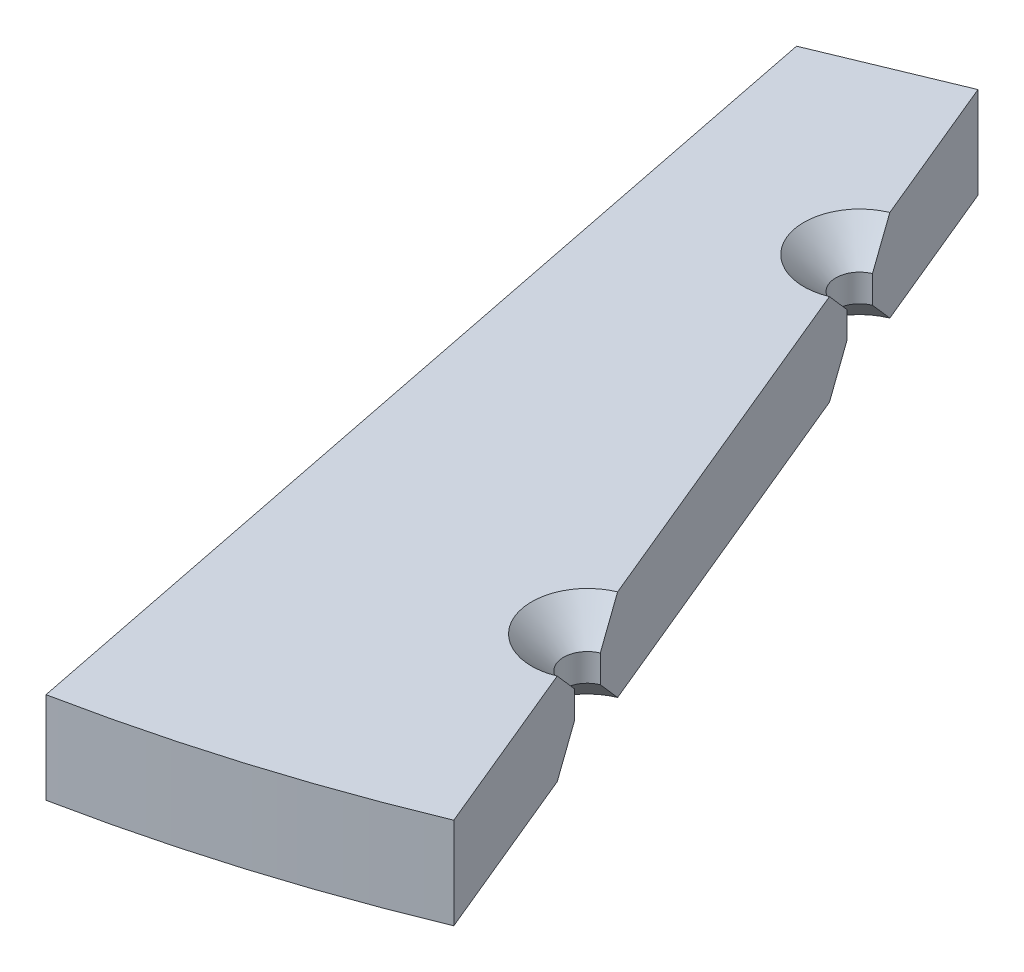
ISO-10303-21;
HEADER;
FILE_DESCRIPTION(('STEP AP214'),'2;1');
FILE_NAME('part.step','',(''),(''),'','','');
FILE_SCHEMA(('AUTOMOTIVE_DESIGN { 1 0 10303 214 1 1 1 1 }'));
ENDSEC;
DATA;
#1=APPLICATION_CONTEXT('core data for automotive mechanical design processes');
#2=APPLICATION_PROTOCOL_DEFINITION('international standard','automotive_design',2000,#1);
#3=PRODUCT_CONTEXT('',#1,'mechanical');
#4=PRODUCT('Part','Part','',(#3));
#5=PRODUCT_RELATED_PRODUCT_CATEGORY('part','',(#4));
#6=PRODUCT_DEFINITION_FORMATION('','',#4);
#7=PRODUCT_DEFINITION_CONTEXT('part definition',#1,'design');
#8=PRODUCT_DEFINITION('design','',#6,#7);
#9=PRODUCT_DEFINITION_SHAPE('','',#8);
#10=(LENGTH_UNIT() NAMED_UNIT(*) SI_UNIT(.MILLI.,.METRE.));
#11=(NAMED_UNIT(*) PLANE_ANGLE_UNIT() SI_UNIT($,.RADIAN.));
#12=(NAMED_UNIT(*) SI_UNIT($,.STERADIAN.) SOLID_ANGLE_UNIT());
#13=UNCERTAINTY_MEASURE_WITH_UNIT(LENGTH_MEASURE(1.E-05),#10,'distance_accuracy_value','');
#14=(GEOMETRIC_REPRESENTATION_CONTEXT(3) GLOBAL_UNCERTAINTY_ASSIGNED_CONTEXT((#13)) GLOBAL_UNIT_ASSIGNED_CONTEXT((#10,
#11,#12)) REPRESENTATION_CONTEXT('',''));
#15=CARTESIAN_POINT('',(0.,0.,0.));
#16=DIRECTION('',(0.,0.,1.));
#17=DIRECTION('',(1.,0.,0.));
#18=AXIS2_PLACEMENT_3D('',#15,#16,#17);
#19=CARTESIAN_POINT('',(39.0337101012386,-0.00999999999999959,94.2357123161515));
#20=DIRECTION('',(0.,1.,0.));
#21=DIRECTION('',(0.,0.,1.));
#22=AXIS2_PLACEMENT_3D('',#19,#20,#21);
#23=CYLINDRICAL_SURFACE('',#22,2.60000000000001);
#24=DIRECTION('',(0.,1.,0.));
#25=VECTOR('',#24,1.);
#26=CARTESIAN_POINT('',(38.0387331770894,-0.00999999999999959,91.8336255316221));
#27=LINE('',#26,#25);
#28=CARTESIAN_POINT('',(38.0387331770894,3.49000000000001,91.8336255316221));
#29=VERTEX_POINT('',#28);
#30=CARTESIAN_POINT('',(38.0387331770894,6.48999999999999,91.8336255316221));
#31=VERTEX_POINT('',#30);
#32=EDGE_CURVE('E161',#29,#31,#27,.T.);
#33=ORIENTED_EDGE('',*,*,#32,.T.);
#34=CARTESIAN_POINT('',(39.0337101012386,6.48999999999999,94.2357123161515));
#35=DIRECTION('',(0.,-1.,0.));
#36=DIRECTION('',(0.,0.,-1.));
#37=AXIS2_PLACEMENT_3D('',#34,#35,#36);
#38=CIRCLE('',#37,2.60000000000001);
#39=CARTESIAN_POINT('',(40.0286870253878,6.48999999999999,96.6377991006809));
#40=VERTEX_POINT('',#39);
#41=EDGE_CURVE('E43',#31,#40,#38,.F.);
#42=ORIENTED_EDGE('',*,*,#41,.T.);
#43=DIRECTION('',(0.,1.,0.));
#44=VECTOR('',#43,1.);
#45=CARTESIAN_POINT('',(40.0286870253878,-0.00999999999999959,96.6377991006809));
#46=LINE('',#45,#44);
#47=CARTESIAN_POINT('',(40.0286870253878,3.49000000000001,96.6377991006809));
#48=VERTEX_POINT('',#47);
#49=EDGE_CURVE('E186',#48,#40,#46,.T.);
#50=ORIENTED_EDGE('',*,*,#49,.F.);
#51=CARTESIAN_POINT('',(39.0337101012386,3.49000000000001,94.2357123161515));
#52=DIRECTION('',(0.,-1.,0.));
#53=DIRECTION('',(0.,0.,-1.));
#54=AXIS2_PLACEMENT_3D('',#51,#52,#53);
#55=CIRCLE('',#54,2.60000000000001);
#56=EDGE_CURVE('E197',#48,#29,#55,.T.);
#57=ORIENTED_EDGE('',*,*,#56,.T.);
#58=EDGE_LOOP('',(#33,#42,#50,#57));
#59=FACE_BOUND('',#58,.T.);
#60=ADVANCED_FACE('F34',(#59),#23,.F.);
#61=CARTESIAN_POINT('',(59.0863219571689,-0.00999999999999959,142.646999819743));
#62=DIRECTION('',(-0.923879532511289,0.,0.382683432365084));
#63=DIRECTION('',(0.382683432365084,0.,0.923879532511289));
#64=AXIS2_PLACEMENT_3D('',#61,#62,#63);
#65=PLANE('',#64);
#66=DIRECTION('',(0.382683432365083,0.,0.923879532511289));
#67=VECTOR('',#66,1.);
#68=CARTESIAN_POINT('',(59.0863219571689,9.99,142.646999819743));
#69=LINE('',#68,#67);
#70=CARTESIAN_POINT('',(41.3680790386656,9.99,99.8713774644704));
#71=VERTEX_POINT('',#70);
#72=CARTESIAN_POINT('',(57.7469299438912,9.99,139.413421455954));
#73=VERTEX_POINT('',#72);
#74=EDGE_CURVE('E162',#71,#73,#69,.T.);
#75=ORIENTED_EDGE('',*,*,#74,.T.);
#76=DIRECTION('',(0.270598050073094,-0.707106781186547,0.653281482438191));
#77=VECTOR('',#76,1.);
#78=CARTESIAN_POINT('',(60.0812988813182,3.89,145.049086604272));
#79=LINE('',#78,#77);
#80=CARTESIAN_POINT('',(59.0863219571689,6.49000000000001,142.646999819743));
#81=VERTEX_POINT('',#80);
#82=EDGE_CURVE('E215',#73,#81,#79,.T.);
#83=ORIENTED_EDGE('',*,*,#82,.T.);
#84=DIRECTION('',(0.,1.,0.));
#85=VECTOR('',#84,1.);
#86=CARTESIAN_POINT('',(59.0863219571689,-0.00999999999999959,142.646999819743));
#87=LINE('',#86,#85);
#88=CARTESIAN_POINT('',(59.0863219571689,3.49,142.646999819743));
#89=VERTEX_POINT('',#88);
#90=EDGE_CURVE('E183',#89,#81,#87,.T.);
#91=ORIENTED_EDGE('',*,*,#90,.F.);
#92=DIRECTION('',(-0.270598050073093,-0.70710678118655,-0.653281482438188));
#93=VECTOR('',#92,1.);
#94=CARTESIAN_POINT('',(60.0812988813182,6.09000000000002,145.049086604272));
#95=LINE('',#94,#93);
#96=CARTESIAN_POINT('',(57.7469299438912,-0.00999999999999959,139.413421455954));
#97=VERTEX_POINT('',#96);
#98=EDGE_CURVE('E193',#89,#97,#95,.T.);
#99=ORIENTED_EDGE('',*,*,#98,.T.);
#100=DIRECTION('',(0.382683432365083,0.,0.923879532511289));
#101=VECTOR('',#100,1.);
#102=CARTESIAN_POINT('',(59.0863219571689,-0.00999999999999959,142.646999819743));
#103=LINE('',#102,#101);
#104=CARTESIAN_POINT('',(41.3680790386656,-0.00999999999999959,99.8713774644704));
#105=VERTEX_POINT('',#104);
#106=EDGE_CURVE('E136',#105,#97,#103,.T.);
#107=ORIENTED_EDGE('',*,*,#106,.F.);
#108=DIRECTION('',(-0.270598050073093,0.70710678118655,-0.653281482438188));
#109=VECTOR('',#108,1.);
#110=CARTESIAN_POINT('',(39.0337101012386,6.09000000000003,94.2357123161515));
#111=LINE('',#110,#109);
#112=EDGE_CURVE('E195',#105,#48,#111,.T.);
#113=ORIENTED_EDGE('',*,*,#112,.T.);
#114=ORIENTED_EDGE('',*,*,#49,.T.);
#115=DIRECTION('',(0.270598050073095,0.707106781186546,0.653281482438192));
#116=VECTOR('',#115,1.);
#117=CARTESIAN_POINT('',(39.0337101012386,3.89,94.2357123161515));
#118=LINE('',#117,#116);
#119=EDGE_CURVE('E56',#40,#71,#118,.T.);
#120=ORIENTED_EDGE('',*,*,#119,.T.);
#121=EDGE_LOOP('',(#75,#83,#91,#99,#107,#113,#114,#120));
#122=FACE_BOUND('',#121,.T.);
#123=ADVANCED_FACE('F220',(#122),#65,.F.);
#124=CARTESIAN_POINT('',(60.0812988813182,-0.00999999999999959,145.049086604272));
#125=DIRECTION('',(0.,1.,0.));
#126=DIRECTION('',(0.,0.,1.));
#127=AXIS2_PLACEMENT_3D('',#124,#125,#126);
#128=CYLINDRICAL_SURFACE('',#127,2.60000000000001);
#129=ORIENTED_EDGE('',*,*,#90,.T.);
#130=CARTESIAN_POINT('',(60.0812988813182,6.49000000000001,145.049086604272));
#131=DIRECTION('',(0.,-1.,0.));
#132=DIRECTION('',(0.,0.,-1.));
#133=AXIS2_PLACEMENT_3D('',#130,#131,#132);
#134=CIRCLE('',#133,2.60000000000001);
#135=CARTESIAN_POINT('',(61.0762758054673,6.49000000000001,147.451173388802));
#136=VERTEX_POINT('',#135);
#137=EDGE_CURVE('E205',#81,#136,#134,.F.);
#138=ORIENTED_EDGE('',*,*,#137,.T.);
#139=DIRECTION('',(0.,1.,0.));
#140=VECTOR('',#139,1.);
#141=CARTESIAN_POINT('',(61.0762758054673,-0.00999999999999959,147.451173388802));
#142=LINE('',#141,#140);
#143=CARTESIAN_POINT('',(61.0762758054673,3.49,147.451173388802));
#144=VERTEX_POINT('',#143);
#145=EDGE_CURVE('E146',#144,#136,#142,.T.);
#146=ORIENTED_EDGE('',*,*,#145,.F.);
#147=CARTESIAN_POINT('',(60.0812988813182,3.49,145.049086604272));
#148=DIRECTION('',(0.,-1.,0.));
#149=DIRECTION('',(0.,0.,-1.));
#150=AXIS2_PLACEMENT_3D('',#147,#148,#149);
#151=CIRCLE('',#150,2.60000000000001);
#152=EDGE_CURVE('E203',#144,#89,#151,.T.);
#153=ORIENTED_EDGE('',*,*,#152,.T.);
#154=EDGE_LOOP('',(#129,#138,#146,#153));
#155=FACE_BOUND('',#154,.T.);
#156=ADVANCED_FACE('F249',(#155),#128,.F.);
#157=CARTESIAN_POINT('',(70.4137515551754,-0.00999999999999959,169.993833982077));
#158=DIRECTION('',(-0.92387953251129,0.,0.382683432365083));
#159=DIRECTION('',(0.382683432365083,0.,0.92387953251129));
#160=AXIS2_PLACEMENT_3D('',#157,#158,#159);
#161=PLANE('',#160);
#162=ORIENTED_EDGE('',*,*,#145,.T.);
#163=DIRECTION('',(0.270598050073094,0.707106781186547,0.653281482438191));
#164=VECTOR('',#163,1.);
#165=CARTESIAN_POINT('',(60.0812988813181,3.89,145.049086604272));
#166=LINE('',#165,#164);
#167=CARTESIAN_POINT('',(62.4156678187451,9.99,150.684751752591));
#168=VERTEX_POINT('',#167);
#169=EDGE_CURVE('E208',#136,#168,#166,.T.);
#170=ORIENTED_EDGE('',*,*,#169,.T.);
#171=DIRECTION('',(0.382683432365083,0.,0.92387953251129));
#172=VECTOR('',#171,1.);
#173=CARTESIAN_POINT('',(70.4137515551754,9.99,169.993833982077));
#174=LINE('',#173,#172);
#175=CARTESIAN_POINT('',(70.4137515551754,9.99,169.993833982077));
#176=VERTEX_POINT('',#175);
#177=EDGE_CURVE('E143',#168,#176,#174,.T.);
#178=ORIENTED_EDGE('',*,*,#177,.T.);
#179=DIRECTION('',(0.,1.,0.));
#180=VECTOR('',#179,1.);
#181=CARTESIAN_POINT('',(70.4137515551754,-0.00999999999999959,169.993833982077));
#182=LINE('',#181,#180);
#183=CARTESIAN_POINT('',(70.4137515551754,-0.00999999999999959,169.993833982077));
#184=VERTEX_POINT('',#183);
#185=EDGE_CURVE('E139',#184,#176,#182,.T.);
#186=ORIENTED_EDGE('',*,*,#185,.F.);
#187=DIRECTION('',(0.382683432365083,0.,0.92387953251129));
#188=VECTOR('',#187,1.);
#189=CARTESIAN_POINT('',(70.4137515551754,-0.00999999999999959,169.993833982077));
#190=LINE('',#189,#188);
#191=CARTESIAN_POINT('',(62.4156678187451,-0.00999999999999959,150.684751752591));
#192=VERTEX_POINT('',#191);
#193=EDGE_CURVE('E125',#192,#184,#190,.T.);
#194=ORIENTED_EDGE('',*,*,#193,.F.);
#195=DIRECTION('',(-0.270598050073093,0.70710678118655,-0.653281482438188));
#196=VECTOR('',#195,1.);
#197=CARTESIAN_POINT('',(60.0812988813181,6.09000000000002,145.049086604272));
#198=LINE('',#197,#196);
#199=EDGE_CURVE('E201',#192,#144,#198,.T.);
#200=ORIENTED_EDGE('',*,*,#199,.T.);
#201=EDGE_LOOP('',(#162,#170,#178,#186,#194,#200));
#202=FACE_BOUND('',#201,.T.);
#203=ADVANCED_FACE('F141',(#202),#161,.F.);
#204=CARTESIAN_POINT('',(0.,-0.00999999999999959,0.));
#205=DIRECTION('',(0.,1.,0.));
#206=DIRECTION('',(0.,0.,1.));
#207=AXIS2_PLACEMENT_3D('',#204,#205,#206);
#208=CYLINDRICAL_SURFACE('',#207,184.);
#209=CARTESIAN_POINT('',(0.,9.99,0.));
#210=DIRECTION('',(0.,-1.,0.));
#211=DIRECTION('',(0.,0.,1.));
#212=AXIS2_PLACEMENT_3D('',#209,#210,#211);
#213=CIRCLE('',#212,184.);
#214=CARTESIAN_POINT('',(36.229696886259,9.99,180.397918678486));
#215=VERTEX_POINT('',#214);
#216=EDGE_CURVE('E166',#176,#215,#213,.T.);
#217=ORIENTED_EDGE('',*,*,#216,.T.);
#218=DIRECTION('',(0.,1.,0.));
#219=VECTOR('',#218,1.);
#220=CARTESIAN_POINT('',(36.229696886259,-0.00999999999999959,180.397918678486));
#221=LINE('',#220,#219);
#222=CARTESIAN_POINT('',(36.229696886259,-0.00999999999999959,180.397918678486));
#223=VERTEX_POINT('',#222);
#224=EDGE_CURVE('E147',#223,#215,#221,.T.);
#225=ORIENTED_EDGE('',*,*,#224,.F.);
#226=CARTESIAN_POINT('',(0.,-0.00999999999999959,0.));
#227=DIRECTION('',(0.,-1.,0.));
#228=DIRECTION('',(0.,0.,1.));
#229=AXIS2_PLACEMENT_3D('',#226,#227,#228);
#230=CIRCLE('',#229,184.);
#231=EDGE_CURVE('E130',#184,#223,#230,.T.);
#232=ORIENTED_EDGE('',*,*,#231,.F.);
#233=ORIENTED_EDGE('',*,*,#185,.T.);
#234=EDGE_LOOP('',(#217,#225,#232,#233));
#235=FACE_BOUND('',#234,.T.);
#236=ADVANCED_FACE('F149',(#235),#208,.T.);
#237=CARTESIAN_POINT('',(15.8517712634232,-0.00999999999999959,77.9511684271959));
#238=DIRECTION('',(0.980785280403232,0.,-0.19509032201612));
#239=DIRECTION('',(-0.19509032201612,0.,-0.980785280403232));
#240=AXIS2_PLACEMENT_3D('',#237,#238,#239);
#241=PLANE('',#240);
#242=DIRECTION('',(-0.19509032201612,0.,-0.980785280403232));
#243=VECTOR('',#242,1.);
#244=CARTESIAN_POINT('',(15.8517712634232,9.99,77.9511684271959));
#245=LINE('',#244,#243);
#246=CARTESIAN_POINT('',(15.8517712634232,9.99,77.9511684271959));
#247=VERTEX_POINT('',#246);
#248=EDGE_CURVE('E168',#215,#247,#245,.T.);
#249=ORIENTED_EDGE('',*,*,#248,.T.);
#250=DIRECTION('',(0.,1.,0.));
#251=VECTOR('',#250,1.);
#252=CARTESIAN_POINT('',(15.8517712634232,-0.00999999999999959,77.9511684271959));
#253=LINE('',#252,#251);
#254=CARTESIAN_POINT('',(15.8517712634232,-0.00999999999999959,77.9511684271959));
#255=VERTEX_POINT('',#254);
#256=EDGE_CURVE('E178',#255,#247,#253,.T.);
#257=ORIENTED_EDGE('',*,*,#256,.F.);
#258=DIRECTION('',(-0.19509032201612,0.,-0.980785280403232));
#259=VECTOR('',#258,1.);
#260=CARTESIAN_POINT('',(15.8517712634232,-0.00999999999999959,77.9511684271959));
#261=LINE('',#260,#259);
#262=EDGE_CURVE('E152',#223,#255,#261,.T.);
#263=ORIENTED_EDGE('',*,*,#262,.F.);
#264=ORIENTED_EDGE('',*,*,#224,.T.);
#265=EDGE_LOOP('',(#249,#257,#263,#264));
#266=FACE_BOUND('',#265,.T.);
#267=ADVANCED_FACE('F279',(#266),#241,.F.);
#268=CARTESIAN_POINT('',(15.8517712634232,-0.00999999999999959,77.9511684271959));
#269=DIRECTION('',(0.382683432365084,0.,0.923879532511289));
#270=DIRECTION('',(0.923879532511289,0.,-0.382683432365084));
#271=AXIS2_PLACEMENT_3D('',#268,#269,#270);
#272=PLANE('',#271);
#273=DIRECTION('',(0.923879532511289,0.,-0.382683432365084));
#274=VECTOR('',#273,1.);
#275=CARTESIAN_POINT('',(15.8517712634232,9.99,77.9511684271959));
#276=LINE('',#275,#274);
#277=CARTESIAN_POINT('',(29.8813380527613,9.99,72.139931588833));
#278=VERTEX_POINT('',#277);
#279=EDGE_CURVE('E170',#247,#278,#276,.T.);
#280=ORIENTED_EDGE('',*,*,#279,.T.);
#281=DIRECTION('',(0.,1.,0.));
#282=VECTOR('',#281,1.);
#283=CARTESIAN_POINT('',(29.8813380527613,-0.00999999999999959,72.139931588833));
#284=LINE('',#283,#282);
#285=CARTESIAN_POINT('',(29.8813380527613,-0.00999999999999959,72.139931588833));
#286=VERTEX_POINT('',#285);
#287=EDGE_CURVE('E175',#286,#278,#284,.T.);
#288=ORIENTED_EDGE('',*,*,#287,.F.);
#289=DIRECTION('',(0.923879532511289,0.,-0.382683432365084));
#290=VECTOR('',#289,1.);
#291=CARTESIAN_POINT('',(15.8517712634232,-0.00999999999999959,77.9511684271959));
#292=LINE('',#291,#290);
#293=EDGE_CURVE('E154',#255,#286,#292,.T.);
#294=ORIENTED_EDGE('',*,*,#293,.F.);
#295=ORIENTED_EDGE('',*,*,#256,.T.);
#296=EDGE_LOOP('',(#280,#288,#294,#295));
#297=FACE_BOUND('',#296,.T.);
#298=ADVANCED_FACE('F281',(#297),#272,.F.);
#299=CARTESIAN_POINT('',(38.0387331770894,-0.00999999999999959,91.8336255316221));
#300=DIRECTION('',(-0.923879532511289,0.,0.382683432365085));
#301=DIRECTION('',(0.382683432365085,0.,0.923879532511289));
#302=AXIS2_PLACEMENT_3D('',#299,#300,#301);
#303=PLANE('',#302);
#304=DIRECTION('',(0.382683432365085,0.,0.923879532511289));
#305=VECTOR('',#304,1.);
#306=CARTESIAN_POINT('',(38.0387331770894,9.99,91.8336255316221));
#307=LINE('',#306,#305);
#308=CARTESIAN_POINT('',(36.6993411638116,9.99,88.6000471678326));
#309=VERTEX_POINT('',#308);
#310=EDGE_CURVE('E172',#278,#309,#307,.T.);
#311=ORIENTED_EDGE('',*,*,#310,.T.);
#312=DIRECTION('',(0.270598050073096,-0.707106781186546,0.653281482438191));
#313=VECTOR('',#312,1.);
#314=CARTESIAN_POINT('',(39.0337101012386,3.89,94.2357123161515));
#315=LINE('',#314,#313);
#316=EDGE_CURVE('E11',#309,#31,#315,.T.);
#317=ORIENTED_EDGE('',*,*,#316,.T.);
#318=ORIENTED_EDGE('',*,*,#32,.F.);
#319=DIRECTION('',(-0.270598050073094,-0.70710678118655,-0.653281482438187));
#320=VECTOR('',#319,1.);
#321=CARTESIAN_POINT('',(39.0337101012386,6.09000000000003,94.2357123161515));
#322=LINE('',#321,#320);
#323=CARTESIAN_POINT('',(36.6993411638116,-0.00999999999999959,88.6000471678327));
#324=VERTEX_POINT('',#323);
#325=EDGE_CURVE('E199',#29,#324,#322,.T.);
#326=ORIENTED_EDGE('',*,*,#325,.T.);
#327=DIRECTION('',(0.382683432365085,0.,0.923879532511289));
#328=VECTOR('',#327,1.);
#329=CARTESIAN_POINT('',(38.0387331770894,-0.00999999999999959,91.8336255316221));
#330=LINE('',#329,#328);
#331=EDGE_CURVE('E159',#286,#324,#330,.T.);
#332=ORIENTED_EDGE('',*,*,#331,.F.);
#333=ORIENTED_EDGE('',*,*,#287,.T.);
#334=EDGE_LOOP('',(#311,#317,#318,#326,#332,#333));
#335=FACE_BOUND('',#334,.T.);
#336=ADVANCED_FACE('F230',(#335),#303,.F.);
#337=CARTESIAN_POINT('',(39.0337101012386,-0.00999999999999959,94.2357123161515));
#338=DIRECTION('',(0.,-1.,0.));
#339=DIRECTION('',(0.,0.,-1.));
#340=AXIS2_PLACEMENT_3D('',#337,#338,#339);
#341=PLANE('',#340);
#342=ORIENTED_EDGE('',*,*,#331,.T.);
#343=CARTESIAN_POINT('',(39.0337101012386,-0.00999999999999959,94.2357123161515));
#344=DIRECTION('',(0.,-1.,0.));
#345=DIRECTION('',(0.,0.,-1.));
#346=AXIS2_PLACEMENT_3D('',#343,#344,#345);
#347=CIRCLE('',#346,6.09999999999999);
#348=EDGE_CURVE('E190',#324,#105,#347,.F.);
#349=ORIENTED_EDGE('',*,*,#348,.T.);
#350=ORIENTED_EDGE('',*,*,#106,.T.);
#351=CARTESIAN_POINT('',(60.0812988813182,-0.00999999999999959,145.049086604272));
#352=DIRECTION('',(0.,-1.,0.));
#353=DIRECTION('',(0.,0.,-1.));
#354=AXIS2_PLACEMENT_3D('',#351,#352,#353);
#355=CIRCLE('',#354,6.09999999999998);
#356=EDGE_CURVE('E134',#97,#192,#355,.F.);
#357=ORIENTED_EDGE('',*,*,#356,.T.);
#358=ORIENTED_EDGE('',*,*,#193,.T.);
#359=ORIENTED_EDGE('',*,*,#231,.T.);
#360=ORIENTED_EDGE('',*,*,#262,.T.);
#361=ORIENTED_EDGE('',*,*,#293,.T.);
#362=EDGE_LOOP('',(#342,#349,#350,#357,#358,#359,#360,#361));
#363=FACE_BOUND('',#362,.T.);
#364=ADVANCED_FACE('F128',(#363),#341,.T.);
#365=CARTESIAN_POINT('',(39.0337101012386,9.99,94.2357123161515));
#366=DIRECTION('',(0.,-1.,0.));
#367=DIRECTION('',(0.,0.,-1.));
#368=AXIS2_PLACEMENT_3D('',#365,#366,#367);
#369=PLANE('',#368);
#370=ORIENTED_EDGE('',*,*,#177,.F.);
#371=CARTESIAN_POINT('',(60.0812988813182,9.99,145.049086604272));
#372=DIRECTION('',(0.,-1.,0.));
#373=DIRECTION('',(0.,0.,-1.));
#374=AXIS2_PLACEMENT_3D('',#371,#372,#373);
#375=CIRCLE('',#374,6.10000000000001);
#376=EDGE_CURVE('E212',#168,#73,#375,.T.);
#377=ORIENTED_EDGE('',*,*,#376,.T.);
#378=ORIENTED_EDGE('',*,*,#74,.F.);
#379=CARTESIAN_POINT('',(39.0337101012386,9.99,94.2357123161515));
#380=DIRECTION('',(0.,-1.,0.));
#381=DIRECTION('',(0.,0.,-1.));
#382=AXIS2_PLACEMENT_3D('',#379,#380,#381);
#383=CIRCLE('',#382,6.10000000000003);
#384=EDGE_CURVE('E210',#71,#309,#383,.T.);
#385=ORIENTED_EDGE('',*,*,#384,.T.);
#386=ORIENTED_EDGE('',*,*,#310,.F.);
#387=ORIENTED_EDGE('',*,*,#279,.F.);
#388=ORIENTED_EDGE('',*,*,#248,.F.);
#389=ORIENTED_EDGE('',*,*,#216,.F.);
#390=EDGE_LOOP('',(#370,#377,#378,#385,#386,#387,#388,#389));
#391=FACE_BOUND('',#390,.T.);
#392=ADVANCED_FACE('F235',(#391),#369,.F.);
#393=CARTESIAN_POINT('',(39.0337101012386,-0.00999999999999959,94.2357123161515));
#394=DIRECTION('',(0.,-1.,0.));
#395=DIRECTION('',(0.,0.,-1.));
#396=AXIS2_PLACEMENT_3D('',#393,#394,#395);
#397=CONICAL_SURFACE('',#396,6.09999999999999,0.785398163397445);
#398=ORIENTED_EDGE('',*,*,#325,.F.);
#399=ORIENTED_EDGE('',*,*,#56,.F.);
#400=ORIENTED_EDGE('',*,*,#112,.F.);
#401=ORIENTED_EDGE('',*,*,#348,.F.);
#402=EDGE_LOOP('',(#398,#399,#400,#401));
#403=FACE_BOUND('',#402,.T.);
#404=ADVANCED_FACE('F226',(#403),#397,.F.);
#405=CARTESIAN_POINT('',(60.0812988813182,-0.00999999999999959,145.049086604272));
#406=DIRECTION('',(0.,-1.,0.));
#407=DIRECTION('',(0.,0.,-1.));
#408=AXIS2_PLACEMENT_3D('',#405,#406,#407);
#409=CONICAL_SURFACE('',#408,6.09999999999998,0.785398163397445);
#410=ORIENTED_EDGE('',*,*,#98,.F.);
#411=ORIENTED_EDGE('',*,*,#152,.F.);
#412=ORIENTED_EDGE('',*,*,#199,.F.);
#413=ORIENTED_EDGE('',*,*,#356,.F.);
#414=EDGE_LOOP('',(#410,#411,#412,#413));
#415=FACE_BOUND('',#414,.T.);
#416=ADVANCED_FACE('F242',(#415),#409,.F.);
#417=CARTESIAN_POINT('',(60.0812988813182,6.49000000000001,145.049086604272));
#418=DIRECTION('',(0.,1.,0.));
#419=DIRECTION('',(0.,0.,1.));
#420=AXIS2_PLACEMENT_3D('',#417,#418,#419);
#421=CONICAL_SURFACE('',#420,2.60000000000001,0.78539816339745);
#422=ORIENTED_EDGE('',*,*,#82,.F.);
#423=ORIENTED_EDGE('',*,*,#376,.F.);
#424=ORIENTED_EDGE('',*,*,#169,.F.);
#425=ORIENTED_EDGE('',*,*,#137,.F.);
#426=EDGE_LOOP('',(#422,#423,#424,#425));
#427=FACE_BOUND('',#426,.T.);
#428=ADVANCED_FACE('F238',(#427),#421,.F.);
#429=CARTESIAN_POINT('',(39.0337101012386,6.48999999999999,94.2357123161515));
#430=DIRECTION('',(0.,1.,0.));
#431=DIRECTION('',(0.,0.,1.));
#432=AXIS2_PLACEMENT_3D('',#429,#430,#431);
#433=CONICAL_SURFACE('',#432,2.60000000000001,0.785398163397451);
#434=ORIENTED_EDGE('',*,*,#316,.F.);
#435=ORIENTED_EDGE('',*,*,#384,.F.);
#436=ORIENTED_EDGE('',*,*,#119,.F.);
#437=ORIENTED_EDGE('',*,*,#41,.F.);
#438=EDGE_LOOP('',(#434,#435,#436,#437));
#439=FACE_BOUND('',#438,.T.);
#440=ADVANCED_FACE('F37',(#439),#433,.F.);
#441=CLOSED_SHELL('',(#60,#123,#156,#203,#236,#267,#298,#336,#364,#392,#404,#416,#428,#440));
#442=MANIFOLD_SOLID_BREP('B2',#441);
#443=ADVANCED_BREP_SHAPE_REPRESENTATION('',(#18,#442),#14);
#444=SHAPE_DEFINITION_REPRESENTATION(#9,#443);
ENDSEC;
END-ISO-10303-21;
